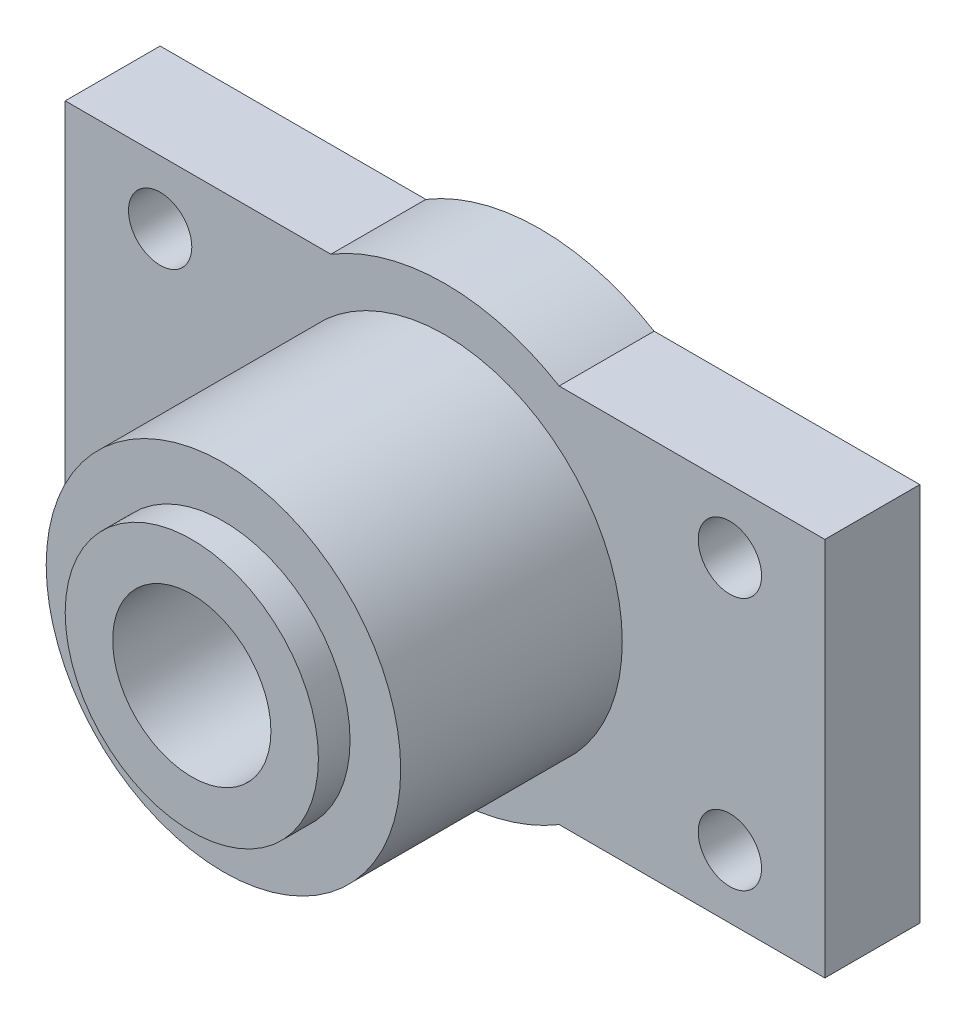
ISO-10303-21;
HEADER;
FILE_DESCRIPTION(('STEP AP214'),'2;1');
FILE_NAME('part.step','',(''),(''),'','','');
FILE_SCHEMA(('AUTOMOTIVE_DESIGN { 1 0 10303 214 1 1 1 1 }'));
ENDSEC;
DATA;
#1=APPLICATION_CONTEXT('core data for automotive mechanical design processes');
#2=APPLICATION_PROTOCOL_DEFINITION('international standard','automotive_design',2000,#1);
#3=PRODUCT_CONTEXT('',#1,'mechanical');
#4=PRODUCT('Part','Part','',(#3));
#5=PRODUCT_RELATED_PRODUCT_CATEGORY('part','',(#4));
#6=PRODUCT_DEFINITION_FORMATION('','',#4);
#7=PRODUCT_DEFINITION_CONTEXT('part definition',#1,'design');
#8=PRODUCT_DEFINITION('design','',#6,#7);
#9=PRODUCT_DEFINITION_SHAPE('','',#8);
#10=(LENGTH_UNIT() NAMED_UNIT(*) SI_UNIT(.MILLI.,.METRE.));
#11=(NAMED_UNIT(*) PLANE_ANGLE_UNIT() SI_UNIT($,.RADIAN.));
#12=(NAMED_UNIT(*) SI_UNIT($,.STERADIAN.) SOLID_ANGLE_UNIT());
#13=UNCERTAINTY_MEASURE_WITH_UNIT(LENGTH_MEASURE(1.E-05),#10,'distance_accuracy_value','');
#14=(GEOMETRIC_REPRESENTATION_CONTEXT(3) GLOBAL_UNCERTAINTY_ASSIGNED_CONTEXT((#13)) GLOBAL_UNIT_ASSIGNED_CONTEXT((#10,
#11,#12)) REPRESENTATION_CONTEXT('',''));
#15=CARTESIAN_POINT('',(0.,0.,0.));
#16=DIRECTION('',(0.,0.,1.));
#17=DIRECTION('',(1.,0.,0.));
#18=AXIS2_PLACEMENT_3D('',#15,#16,#17);
#19=CARTESIAN_POINT('',(0.,0.,15.));
#20=DIRECTION('',(0.,0.,1.));
#21=DIRECTION('',(1.,0.,0.));
#22=AXIS2_PLACEMENT_3D('',#19,#20,#21);
#23=PLANE('',#22);
#24=CARTESIAN_POINT('',(0.,0.,15.));
#25=DIRECTION('',(0.,0.,-1.));
#26=DIRECTION('',(1.,0.,0.));
#27=AXIS2_PLACEMENT_3D('',#24,#25,#26);
#28=CIRCLE('',#27,12.5);
#29=CARTESIAN_POINT('',(12.5,0.,15.));
#30=VERTEX_POINT('',#29);
#31=EDGE_CURVE('E24',#30,#30,#28,.T.);
#32=ORIENTED_EDGE('',*,*,#31,.F.);
#33=EDGE_LOOP('',(#32));
#34=FACE_BOUND('',#33,.T.);
#35=ADVANCED_FACE('F16',(#34),#23,.T.);
#36=CARTESIAN_POINT('',(0.,0.,0.));
#37=DIRECTION('',(0.,0.,-1.));
#38=DIRECTION('',(1.,0.,0.));
#39=AXIS2_PLACEMENT_3D('',#36,#37,#38);
#40=CYLINDRICAL_SURFACE('',#39,12.5);
#41=ORIENTED_EDGE('',*,*,#31,.T.);
#42=DIRECTION('',(0.,0.,1.));
#43=VECTOR('',#42,1.);
#44=CARTESIAN_POINT('',(12.5,0.,0.));
#45=LINE('',#44,#43);
#46=CARTESIAN_POINT('',(12.5,0.,55.));
#47=VERTEX_POINT('',#46);
#48=EDGE_CURVE('E10',#30,#47,#45,.T.);
#49=ORIENTED_EDGE('',*,*,#48,.T.);
#50=CARTESIAN_POINT('',(0.,0.,55.));
#51=DIRECTION('',(0.,0.,-1.));
#52=DIRECTION('',(1.,0.,0.));
#53=AXIS2_PLACEMENT_3D('',#50,#51,#52);
#54=CIRCLE('',#53,12.5);
#55=EDGE_CURVE('E294',#47,#47,#54,.T.);
#56=ORIENTED_EDGE('',*,*,#55,.F.);
#57=ORIENTED_EDGE('',*,*,#48,.F.);
#58=EDGE_LOOP('',(#41,#49,#56,#57));
#59=FACE_BOUND('',#58,.T.);
#60=ADVANCED_FACE('F317',(#59),#40,.F.);
#61=CARTESIAN_POINT('',(0.,0.,55.));
#62=DIRECTION('',(0.,0.,1.));
#63=DIRECTION('',(1.,0.,0.));
#64=AXIS2_PLACEMENT_3D('',#61,#62,#63);
#65=PLANE('',#64);
#66=ORIENTED_EDGE('',*,*,#55,.T.);
#67=EDGE_LOOP('',(#66));
#68=FACE_BOUND('',#67,.T.);
#69=CARTESIAN_POINT('',(0.,0.,55.));
#70=DIRECTION('',(0.,0.,1.));
#71=DIRECTION('',(1.,0.,0.));
#72=AXIS2_PLACEMENT_3D('',#69,#70,#71);
#73=CIRCLE('',#72,20.);
#74=CARTESIAN_POINT('',(20.,0.,55.));
#75=VERTEX_POINT('',#74);
#76=EDGE_CURVE('E291',#75,#75,#73,.T.);
#77=ORIENTED_EDGE('',*,*,#76,.T.);
#78=EDGE_LOOP('',(#77));
#79=FACE_BOUND('',#78,.T.);
#80=ADVANCED_FACE('F324',(#68,#79),#65,.T.);
#81=CARTESIAN_POINT('',(0.,0.,50.));
#82=DIRECTION('',(0.,0.,1.));
#83=DIRECTION('',(1.,0.,0.));
#84=AXIS2_PLACEMENT_3D('',#81,#82,#83);
#85=CYLINDRICAL_SURFACE('',#84,20.);
#86=CARTESIAN_POINT('',(0.,0.,50.));
#87=DIRECTION('',(0.,0.,1.));
#88=DIRECTION('',(1.,0.,0.));
#89=AXIS2_PLACEMENT_3D('',#86,#87,#88);
#90=CIRCLE('',#89,20.);
#91=CARTESIAN_POINT('',(20.,0.,50.));
#92=VERTEX_POINT('',#91);
#93=EDGE_CURVE('E306',#92,#92,#90,.T.);
#94=ORIENTED_EDGE('',*,*,#93,.T.);
#95=DIRECTION('',(0.,0.,1.));
#96=VECTOR('',#95,1.);
#97=CARTESIAN_POINT('',(20.,0.,50.));
#98=LINE('',#97,#96);
#99=EDGE_CURVE('E295',#92,#75,#98,.T.);
#100=ORIENTED_EDGE('',*,*,#99,.T.);
#101=ORIENTED_EDGE('',*,*,#76,.F.);
#102=ORIENTED_EDGE('',*,*,#99,.F.);
#103=EDGE_LOOP('',(#94,#100,#101,#102));
#104=FACE_BOUND('',#103,.T.);
#105=ADVANCED_FACE('F329',(#104),#85,.T.);
#106=CARTESIAN_POINT('',(0.,0.,50.));
#107=DIRECTION('',(0.,0.,1.));
#108=DIRECTION('',(1.,0.,0.));
#109=AXIS2_PLACEMENT_3D('',#106,#107,#108);
#110=PLANE('',#109);
#111=ORIENTED_EDGE('',*,*,#93,.F.);
#112=EDGE_LOOP('',(#111));
#113=FACE_BOUND('',#112,.T.);
#114=CARTESIAN_POINT('',(0.,0.,50.));
#115=DIRECTION('',(0.,0.,1.));
#116=DIRECTION('',(1.,0.,0.));
#117=AXIS2_PLACEMENT_3D('',#114,#115,#116);
#118=CIRCLE('',#117,28.);
#119=CARTESIAN_POINT('',(28.,0.,50.));
#120=VERTEX_POINT('',#119);
#121=EDGE_CURVE('E303',#120,#120,#118,.T.);
#122=ORIENTED_EDGE('',*,*,#121,.T.);
#123=EDGE_LOOP('',(#122));
#124=FACE_BOUND('',#123,.T.);
#125=ADVANCED_FACE('F334',(#113,#124),#110,.T.);
#126=CARTESIAN_POINT('',(0.,0.,15.));
#127=DIRECTION('',(0.,0.,1.));
#128=DIRECTION('',(1.,0.,0.));
#129=AXIS2_PLACEMENT_3D('',#126,#127,#128);
#130=CYLINDRICAL_SURFACE('',#129,28.);
#131=CARTESIAN_POINT('',(0.,0.,15.));
#132=DIRECTION('',(0.,0.,1.));
#133=DIRECTION('',(1.,0.,0.));
#134=AXIS2_PLACEMENT_3D('',#131,#132,#133);
#135=CIRCLE('',#134,28.);
#136=CARTESIAN_POINT('',(28.,0.,15.));
#137=VERTEX_POINT('',#136);
#138=EDGE_CURVE('E290',#137,#137,#135,.T.);
#139=ORIENTED_EDGE('',*,*,#138,.T.);
#140=DIRECTION('',(0.,0.,1.));
#141=VECTOR('',#140,1.);
#142=CARTESIAN_POINT('',(28.,0.,15.));
#143=LINE('',#142,#141);
#144=EDGE_CURVE('E299',#137,#120,#143,.T.);
#145=ORIENTED_EDGE('',*,*,#144,.T.);
#146=ORIENTED_EDGE('',*,*,#121,.F.);
#147=ORIENTED_EDGE('',*,*,#144,.F.);
#148=EDGE_LOOP('',(#139,#145,#146,#147));
#149=FACE_BOUND('',#148,.T.);
#150=ADVANCED_FACE('F336',(#149),#130,.T.);
#151=CARTESIAN_POINT('',(0.,0.,15.));
#152=DIRECTION('',(0.,0.,1.));
#153=DIRECTION('',(1.,0.,0.));
#154=AXIS2_PLACEMENT_3D('',#151,#152,#153);
#155=PLANE('',#154);
#156=CARTESIAN_POINT('',(-45.,-20.,15.));
#157=DIRECTION('',(0.,0.,-1.));
#158=DIRECTION('',(1.,0.,0.));
#159=AXIS2_PLACEMENT_3D('',#156,#157,#158);
#160=CIRCLE('',#159,5.);
#161=CARTESIAN_POINT('',(-40.,-20.,15.));
#162=VERTEX_POINT('',#161);
#163=EDGE_CURVE('E282',#162,#162,#160,.T.);
#164=ORIENTED_EDGE('',*,*,#163,.T.);
#165=EDGE_LOOP('',(#164));
#166=FACE_BOUND('',#165,.T.);
#167=CARTESIAN_POINT('',(-45.,20.,15.));
#168=DIRECTION('',(0.,0.,-1.));
#169=DIRECTION('',(1.,0.,0.));
#170=AXIS2_PLACEMENT_3D('',#167,#168,#169);
#171=CIRCLE('',#170,5.);
#172=CARTESIAN_POINT('',(-40.,20.,15.));
#173=VERTEX_POINT('',#172);
#174=EDGE_CURVE('E195',#173,#173,#171,.T.);
#175=ORIENTED_EDGE('',*,*,#174,.T.);
#176=EDGE_LOOP('',(#175));
#177=FACE_BOUND('',#176,.T.);
#178=ORIENTED_EDGE('',*,*,#138,.F.);
#179=EDGE_LOOP('',(#178));
#180=FACE_BOUND('',#179,.T.);
#181=CARTESIAN_POINT('',(45.,20.,15.));
#182=DIRECTION('',(0.,0.,-1.));
#183=DIRECTION('',(1.,0.,0.));
#184=AXIS2_PLACEMENT_3D('',#181,#182,#183);
#185=CIRCLE('',#184,5.);
#186=CARTESIAN_POINT('',(50.,20.,15.));
#187=VERTEX_POINT('',#186);
#188=EDGE_CURVE('E244',#187,#187,#185,.T.);
#189=ORIENTED_EDGE('',*,*,#188,.T.);
#190=EDGE_LOOP('',(#189));
#191=FACE_BOUND('',#190,.T.);
#192=CARTESIAN_POINT('',(45.,-20.,15.));
#193=DIRECTION('',(0.,0.,-1.));
#194=DIRECTION('',(1.,0.,0.));
#195=AXIS2_PLACEMENT_3D('',#192,#193,#194);
#196=CIRCLE('',#195,5.);
#197=CARTESIAN_POINT('',(50.,-20.,15.));
#198=VERTEX_POINT('',#197);
#199=EDGE_CURVE('E159',#198,#198,#196,.T.);
#200=ORIENTED_EDGE('',*,*,#199,.T.);
#201=EDGE_LOOP('',(#200));
#202=FACE_BOUND('',#201,.T.);
#203=DIRECTION('',(-1.,0.,0.));
#204=VECTOR('',#203,1.);
#205=CARTESIAN_POINT('',(60.,30.,15.));
#206=LINE('',#205,#204);
#207=CARTESIAN_POINT('',(60.,30.,15.));
#208=VERTEX_POINT('',#207);
#209=CARTESIAN_POINT('',(18.027756377319,30.,15.));
#210=VERTEX_POINT('',#209);
#211=EDGE_CURVE('E223',#208,#210,#206,.T.);
#212=ORIENTED_EDGE('',*,*,#211,.T.);
#213=CARTESIAN_POINT('',(0.,0.,15.));
#214=DIRECTION('',(0.,0.,1.));
#215=DIRECTION('',(1.,0.,0.));
#216=AXIS2_PLACEMENT_3D('',#213,#214,#215);
#217=CIRCLE('',#216,35.);
#218=CARTESIAN_POINT('',(-18.02775637732,30.,15.));
#219=VERTEX_POINT('',#218);
#220=EDGE_CURVE('E260',#210,#219,#217,.T.);
#221=ORIENTED_EDGE('',*,*,#220,.T.);
#222=DIRECTION('',(-1.,0.,0.));
#223=VECTOR('',#222,1.);
#224=CARTESIAN_POINT('',(60.,30.,15.));
#225=LINE('',#224,#223);
#226=CARTESIAN_POINT('',(-60.,30.,15.));
#227=VERTEX_POINT('',#226);
#228=EDGE_CURVE('E214',#219,#227,#225,.T.);
#229=ORIENTED_EDGE('',*,*,#228,.T.);
#230=DIRECTION('',(0.,-1.,0.));
#231=VECTOR('',#230,1.);
#232=CARTESIAN_POINT('',(-60.,30.,15.));
#233=LINE('',#232,#231);
#234=CARTESIAN_POINT('',(-60.,-30.,15.));
#235=VERTEX_POINT('',#234);
#236=EDGE_CURVE('E265',#227,#235,#233,.T.);
#237=ORIENTED_EDGE('',*,*,#236,.T.);
#238=DIRECTION('',(1.,0.,0.));
#239=VECTOR('',#238,1.);
#240=CARTESIAN_POINT('',(-60.,-30.,15.));
#241=LINE('',#240,#239);
#242=CARTESIAN_POINT('',(-18.02775637732,-30.,15.));
#243=VERTEX_POINT('',#242);
#244=EDGE_CURVE('E213',#235,#243,#241,.T.);
#245=ORIENTED_EDGE('',*,*,#244,.T.);
#246=CARTESIAN_POINT('',(0.,0.,15.));
#247=DIRECTION('',(0.,0.,1.));
#248=DIRECTION('',(1.,0.,0.));
#249=AXIS2_PLACEMENT_3D('',#246,#247,#248);
#250=CIRCLE('',#249,35.);
#251=CARTESIAN_POINT('',(18.027756377319,-30.,15.));
#252=VERTEX_POINT('',#251);
#253=EDGE_CURVE('E198',#243,#252,#250,.T.);
#254=ORIENTED_EDGE('',*,*,#253,.T.);
#255=DIRECTION('',(1.,0.,0.));
#256=VECTOR('',#255,1.);
#257=CARTESIAN_POINT('',(-60.,-30.,15.));
#258=LINE('',#257,#256);
#259=CARTESIAN_POINT('',(60.,-30.,15.));
#260=VERTEX_POINT('',#259);
#261=EDGE_CURVE('E241',#252,#260,#258,.T.);
#262=ORIENTED_EDGE('',*,*,#261,.T.);
#263=DIRECTION('',(0.,1.,0.));
#264=VECTOR('',#263,1.);
#265=CARTESIAN_POINT('',(60.,-30.,15.));
#266=LINE('',#265,#264);
#267=EDGE_CURVE('E234',#260,#208,#266,.T.);
#268=ORIENTED_EDGE('',*,*,#267,.T.);
#269=EDGE_LOOP('',(#212,#221,#229,#237,#245,#254,#262,#268));
#270=FACE_BOUND('',#269,.T.);
#271=ADVANCED_FACE('F339',(#166,#177,#180,#191,#202,#270),#155,.T.);
#272=CARTESIAN_POINT('',(0.,0.,0.));
#273=DIRECTION('',(0.,0.,1.));
#274=DIRECTION('',(1.,0.,0.));
#275=AXIS2_PLACEMENT_3D('',#272,#273,#274);
#276=CYLINDRICAL_SURFACE('',#275,35.);
#277=CARTESIAN_POINT('',(0.,0.,0.));
#278=DIRECTION('',(0.,0.,1.));
#279=DIRECTION('',(1.,0.,0.));
#280=AXIS2_PLACEMENT_3D('',#277,#278,#279);
#281=CIRCLE('',#280,35.);
#282=CARTESIAN_POINT('',(-18.02775637732,-30.,0.));
#283=VERTEX_POINT('',#282);
#284=CARTESIAN_POINT('',(18.027756377319,-30.,0.));
#285=VERTEX_POINT('',#284);
#286=EDGE_CURVE('E179',#283,#285,#281,.T.);
#287=ORIENTED_EDGE('',*,*,#286,.T.);
#288=DIRECTION('',(0.,0.,1.));
#289=VECTOR('',#288,1.);
#290=CARTESIAN_POINT('',(18.02775637732,-30.,0.));
#291=LINE('',#290,#289);
#292=EDGE_CURVE('E161',#285,#252,#291,.T.);
#293=ORIENTED_EDGE('',*,*,#292,.T.);
#294=ORIENTED_EDGE('',*,*,#253,.F.);
#295=DIRECTION('',(0.,0.,1.));
#296=VECTOR('',#295,1.);
#297=CARTESIAN_POINT('',(-18.02775637732,-30.,0.));
#298=LINE('',#297,#296);
#299=EDGE_CURVE('E209',#283,#243,#298,.T.);
#300=ORIENTED_EDGE('',*,*,#299,.F.);
#301=EDGE_LOOP('',(#287,#293,#294,#300));
#302=FACE_BOUND('',#301,.T.);
#303=ADVANCED_FACE('F343',(#302),#276,.T.);
#304=CARTESIAN_POINT('',(-45.,20.,0.));
#305=DIRECTION('',(0.,0.,-1.));
#306=DIRECTION('',(1.,0.,0.));
#307=AXIS2_PLACEMENT_3D('',#304,#305,#306);
#308=CYLINDRICAL_SURFACE('',#307,5.);
#309=CARTESIAN_POINT('',(-45.,20.,0.));
#310=DIRECTION('',(0.,0.,1.));
#311=DIRECTION('',(1.,0.,0.));
#312=AXIS2_PLACEMENT_3D('',#309,#310,#311);
#313=CIRCLE('',#312,5.);
#314=CARTESIAN_POINT('',(-40.,20.,0.));
#315=VERTEX_POINT('',#314);
#316=EDGE_CURVE('E208',#315,#315,#313,.T.);
#317=ORIENTED_EDGE('',*,*,#316,.F.);
#318=DIRECTION('',(0.,0.,1.));
#319=VECTOR('',#318,1.);
#320=CARTESIAN_POINT('',(-40.,20.,0.));
#321=LINE('',#320,#319);
#322=EDGE_CURVE('E199',#315,#173,#321,.T.);
#323=ORIENTED_EDGE('',*,*,#322,.T.);
#324=ORIENTED_EDGE('',*,*,#174,.F.);
#325=ORIENTED_EDGE('',*,*,#322,.F.);
#326=EDGE_LOOP('',(#317,#323,#324,#325));
#327=FACE_BOUND('',#326,.T.);
#328=ADVANCED_FACE('F347',(#327),#308,.F.);
#329=CARTESIAN_POINT('',(-45.,-20.,0.));
#330=DIRECTION('',(0.,0.,-1.));
#331=DIRECTION('',(1.,0.,0.));
#332=AXIS2_PLACEMENT_3D('',#329,#330,#331);
#333=CYLINDRICAL_SURFACE('',#332,5.);
#334=CARTESIAN_POINT('',(-45.,-20.,0.));
#335=DIRECTION('',(0.,0.,1.));
#336=DIRECTION('',(1.,0.,0.));
#337=AXIS2_PLACEMENT_3D('',#334,#335,#336);
#338=CIRCLE('',#337,5.);
#339=CARTESIAN_POINT('',(-40.,-20.,0.));
#340=VERTEX_POINT('',#339);
#341=EDGE_CURVE('E218',#340,#340,#338,.T.);
#342=ORIENTED_EDGE('',*,*,#341,.F.);
#343=DIRECTION('',(0.,0.,1.));
#344=VECTOR('',#343,1.);
#345=CARTESIAN_POINT('',(-40.,-20.,0.));
#346=LINE('',#345,#344);
#347=EDGE_CURVE('E278',#340,#162,#346,.T.);
#348=ORIENTED_EDGE('',*,*,#347,.T.);
#349=ORIENTED_EDGE('',*,*,#163,.F.);
#350=ORIENTED_EDGE('',*,*,#347,.F.);
#351=EDGE_LOOP('',(#342,#348,#349,#350));
#352=FACE_BOUND('',#351,.T.);
#353=ADVANCED_FACE('F349',(#352),#333,.F.);
#354=CARTESIAN_POINT('',(-60.,-30.,0.));
#355=DIRECTION('',(0.,1.,0.));
#356=DIRECTION('',(1.,0.,0.));
#357=AXIS2_PLACEMENT_3D('',#354,#355,#356);
#358=PLANE('',#357);
#359=ORIENTED_EDGE('',*,*,#299,.T.);
#360=ORIENTED_EDGE('',*,*,#244,.F.);
#361=DIRECTION('',(0.,0.,1.));
#362=VECTOR('',#361,1.);
#363=CARTESIAN_POINT('',(-60.,-30.,0.));
#364=LINE('',#363,#362);
#365=CARTESIAN_POINT('',(-60.,-30.,0.));
#366=VERTEX_POINT('',#365);
#367=EDGE_CURVE('E261',#366,#235,#364,.T.);
#368=ORIENTED_EDGE('',*,*,#367,.F.);
#369=DIRECTION('',(1.,0.,0.));
#370=VECTOR('',#369,1.);
#371=CARTESIAN_POINT('',(-60.,-30.,0.));
#372=LINE('',#371,#370);
#373=EDGE_CURVE('E183',#366,#283,#372,.T.);
#374=ORIENTED_EDGE('',*,*,#373,.T.);
#375=EDGE_LOOP('',(#359,#360,#368,#374));
#376=FACE_BOUND('',#375,.T.);
#377=ADVANCED_FACE('F352',(#376),#358,.F.);
#378=CARTESIAN_POINT('',(60.,30.,0.));
#379=DIRECTION('',(0.,-1.,0.));
#380=DIRECTION('',(0.,0.,-1.));
#381=AXIS2_PLACEMENT_3D('',#378,#379,#380);
#382=PLANE('',#381);
#383=DIRECTION('',(0.,0.,1.));
#384=VECTOR('',#383,1.);
#385=CARTESIAN_POINT('',(-60.,30.,0.));
#386=LINE('',#385,#384);
#387=CARTESIAN_POINT('',(-60.,30.,0.));
#388=VERTEX_POINT('',#387);
#389=EDGE_CURVE('E269',#388,#227,#386,.T.);
#390=ORIENTED_EDGE('',*,*,#389,.T.);
#391=ORIENTED_EDGE('',*,*,#228,.F.);
#392=DIRECTION('',(0.,0.,1.));
#393=VECTOR('',#392,1.);
#394=CARTESIAN_POINT('',(-18.02775637732,30.,0.));
#395=LINE('',#394,#393);
#396=CARTESIAN_POINT('',(-18.02775637732,30.,0.));
#397=VERTEX_POINT('',#396);
#398=EDGE_CURVE('E247',#397,#219,#395,.T.);
#399=ORIENTED_EDGE('',*,*,#398,.F.);
#400=DIRECTION('',(-1.,0.,0.));
#401=VECTOR('',#400,1.);
#402=CARTESIAN_POINT('',(60.,30.,0.));
#403=LINE('',#402,#401);
#404=EDGE_CURVE('E200',#397,#388,#403,.T.);
#405=ORIENTED_EDGE('',*,*,#404,.T.);
#406=EDGE_LOOP('',(#390,#391,#399,#405));
#407=FACE_BOUND('',#406,.T.);
#408=ADVANCED_FACE('F356',(#407),#382,.F.);
#409=CARTESIAN_POINT('',(-60.,30.,0.));
#410=DIRECTION('',(1.,0.,0.));
#411=DIRECTION('',(0.,1.,0.));
#412=AXIS2_PLACEMENT_3D('',#409,#410,#411);
#413=PLANE('',#412);
#414=DIRECTION('',(0.,-1.,0.));
#415=VECTOR('',#414,1.);
#416=CARTESIAN_POINT('',(-60.,30.,0.));
#417=LINE('',#416,#415);
#418=EDGE_CURVE('E188',#388,#366,#417,.T.);
#419=ORIENTED_EDGE('',*,*,#418,.T.);
#420=ORIENTED_EDGE('',*,*,#367,.T.);
#421=ORIENTED_EDGE('',*,*,#236,.F.);
#422=ORIENTED_EDGE('',*,*,#389,.F.);
#423=EDGE_LOOP('',(#419,#420,#421,#422));
#424=FACE_BOUND('',#423,.T.);
#425=ADVANCED_FACE('F363',(#424),#413,.F.);
#426=CARTESIAN_POINT('',(0.,0.,0.));
#427=DIRECTION('',(0.,0.,1.));
#428=DIRECTION('',(1.,0.,0.));
#429=AXIS2_PLACEMENT_3D('',#426,#427,#428);
#430=CYLINDRICAL_SURFACE('',#429,35.);
#431=DIRECTION('',(0.,0.,1.));
#432=VECTOR('',#431,1.);
#433=CARTESIAN_POINT('',(18.02775637732,30.,0.));
#434=LINE('',#433,#432);
#435=CARTESIAN_POINT('',(18.027756377319,30.,0.));
#436=VERTEX_POINT('',#435);
#437=EDGE_CURVE('E222',#436,#210,#434,.T.);
#438=ORIENTED_EDGE('',*,*,#437,.F.);
#439=CARTESIAN_POINT('',(0.,0.,0.));
#440=DIRECTION('',(0.,0.,1.));
#441=DIRECTION('',(1.,0.,0.));
#442=AXIS2_PLACEMENT_3D('',#439,#440,#441);
#443=CIRCLE('',#442,35.);
#444=EDGE_CURVE('E204',#436,#397,#443,.T.);
#445=ORIENTED_EDGE('',*,*,#444,.T.);
#446=ORIENTED_EDGE('',*,*,#398,.T.);
#447=ORIENTED_EDGE('',*,*,#220,.F.);
#448=EDGE_LOOP('',(#438,#445,#446,#447));
#449=FACE_BOUND('',#448,.T.);
#450=ADVANCED_FACE('F367',(#449),#430,.T.);
#451=CARTESIAN_POINT('',(45.,20.,0.));
#452=DIRECTION('',(0.,0.,-1.));
#453=DIRECTION('',(1.,0.,0.));
#454=AXIS2_PLACEMENT_3D('',#451,#452,#453);
#455=CYLINDRICAL_SURFACE('',#454,5.);
#456=CARTESIAN_POINT('',(45.,20.,0.));
#457=DIRECTION('',(0.,0.,1.));
#458=DIRECTION('',(1.,0.,0.));
#459=AXIS2_PLACEMENT_3D('',#456,#457,#458);
#460=CIRCLE('',#459,5.);
#461=CARTESIAN_POINT('',(50.,20.,0.));
#462=VERTEX_POINT('',#461);
#463=EDGE_CURVE('E166',#462,#462,#460,.T.);
#464=ORIENTED_EDGE('',*,*,#463,.F.);
#465=DIRECTION('',(0.,0.,1.));
#466=VECTOR('',#465,1.);
#467=CARTESIAN_POINT('',(50.,20.,0.));
#468=LINE('',#467,#466);
#469=EDGE_CURVE('E248',#462,#187,#468,.T.);
#470=ORIENTED_EDGE('',*,*,#469,.T.);
#471=ORIENTED_EDGE('',*,*,#188,.F.);
#472=ORIENTED_EDGE('',*,*,#469,.F.);
#473=EDGE_LOOP('',(#464,#470,#471,#472));
#474=FACE_BOUND('',#473,.T.);
#475=ADVANCED_FACE('F369',(#474),#455,.F.);
#476=CARTESIAN_POINT('',(45.,-20.,0.));
#477=DIRECTION('',(0.,0.,-1.));
#478=DIRECTION('',(1.,0.,0.));
#479=AXIS2_PLACEMENT_3D('',#476,#477,#478);
#480=CYLINDRICAL_SURFACE('',#479,5.);
#481=CARTESIAN_POINT('',(45.,-20.,0.));
#482=DIRECTION('',(0.,0.,1.));
#483=DIRECTION('',(1.,0.,0.));
#484=AXIS2_PLACEMENT_3D('',#481,#482,#483);
#485=CIRCLE('',#484,5.);
#486=CARTESIAN_POINT('',(50.,-20.,0.));
#487=VERTEX_POINT('',#486);
#488=EDGE_CURVE('E158',#487,#487,#485,.T.);
#489=ORIENTED_EDGE('',*,*,#488,.F.);
#490=DIRECTION('',(0.,0.,1.));
#491=VECTOR('',#490,1.);
#492=CARTESIAN_POINT('',(50.,-20.,0.));
#493=LINE('',#492,#491);
#494=EDGE_CURVE('E155',#487,#198,#493,.T.);
#495=ORIENTED_EDGE('',*,*,#494,.T.);
#496=ORIENTED_EDGE('',*,*,#199,.F.);
#497=ORIENTED_EDGE('',*,*,#494,.F.);
#498=EDGE_LOOP('',(#489,#495,#496,#497));
#499=FACE_BOUND('',#498,.T.);
#500=ADVANCED_FACE('F157',(#499),#480,.F.);
#501=CARTESIAN_POINT('',(-60.,-30.,0.));
#502=DIRECTION('',(0.,1.,0.));
#503=DIRECTION('',(1.,0.,0.));
#504=AXIS2_PLACEMENT_3D('',#501,#502,#503);
#505=PLANE('',#504);
#506=DIRECTION('',(0.,0.,1.));
#507=VECTOR('',#506,1.);
#508=CARTESIAN_POINT('',(60.,-30.,0.));
#509=LINE('',#508,#507);
#510=CARTESIAN_POINT('',(60.,-30.,0.));
#511=VERTEX_POINT('',#510);
#512=EDGE_CURVE('E237',#511,#260,#509,.T.);
#513=ORIENTED_EDGE('',*,*,#512,.T.);
#514=ORIENTED_EDGE('',*,*,#261,.F.);
#515=ORIENTED_EDGE('',*,*,#292,.F.);
#516=DIRECTION('',(1.,0.,0.));
#517=VECTOR('',#516,1.);
#518=CARTESIAN_POINT('',(-60.,-30.,0.));
#519=LINE('',#518,#517);
#520=EDGE_CURVE('E184',#285,#511,#519,.T.);
#521=ORIENTED_EDGE('',*,*,#520,.T.);
#522=EDGE_LOOP('',(#513,#514,#515,#521));
#523=FACE_BOUND('',#522,.T.);
#524=ADVANCED_FACE('F375',(#523),#505,.F.);
#525=CARTESIAN_POINT('',(60.,-30.,0.));
#526=DIRECTION('',(-1.,0.,0.));
#527=DIRECTION('',(0.,0.,1.));
#528=AXIS2_PLACEMENT_3D('',#525,#526,#527);
#529=PLANE('',#528);
#530=DIRECTION('',(0.,1.,0.));
#531=VECTOR('',#530,1.);
#532=CARTESIAN_POINT('',(60.,-30.,0.));
#533=LINE('',#532,#531);
#534=CARTESIAN_POINT('',(60.,30.,0.));
#535=VERTEX_POINT('',#534);
#536=EDGE_CURVE('E178',#511,#535,#533,.T.);
#537=ORIENTED_EDGE('',*,*,#536,.T.);
#538=DIRECTION('',(0.,0.,1.));
#539=VECTOR('',#538,1.);
#540=CARTESIAN_POINT('',(60.,30.,0.));
#541=LINE('',#540,#539);
#542=EDGE_CURVE('E227',#535,#208,#541,.T.);
#543=ORIENTED_EDGE('',*,*,#542,.T.);
#544=ORIENTED_EDGE('',*,*,#267,.F.);
#545=ORIENTED_EDGE('',*,*,#512,.F.);
#546=EDGE_LOOP('',(#537,#543,#544,#545));
#547=FACE_BOUND('',#546,.T.);
#548=ADVANCED_FACE('F376',(#547),#529,.F.);
#549=CARTESIAN_POINT('',(60.,30.,0.));
#550=DIRECTION('',(0.,-1.,0.));
#551=DIRECTION('',(0.,0.,-1.));
#552=AXIS2_PLACEMENT_3D('',#549,#550,#551);
#553=PLANE('',#552);
#554=ORIENTED_EDGE('',*,*,#437,.T.);
#555=ORIENTED_EDGE('',*,*,#211,.F.);
#556=ORIENTED_EDGE('',*,*,#542,.F.);
#557=DIRECTION('',(-1.,0.,0.));
#558=VECTOR('',#557,1.);
#559=CARTESIAN_POINT('',(60.,30.,0.));
#560=LINE('',#559,#558);
#561=EDGE_CURVE('E172',#535,#436,#560,.T.);
#562=ORIENTED_EDGE('',*,*,#561,.T.);
#563=EDGE_LOOP('',(#554,#555,#556,#562));
#564=FACE_BOUND('',#563,.T.);
#565=ADVANCED_FACE('F379',(#564),#553,.F.);
#566=CARTESIAN_POINT('',(0.,0.,0.));
#567=DIRECTION('',(0.,0.,1.));
#568=DIRECTION('',(1.,0.,0.));
#569=AXIS2_PLACEMENT_3D('',#566,#567,#568);
#570=PLANE('',#569);
#571=ORIENTED_EDGE('',*,*,#341,.T.);
#572=EDGE_LOOP('',(#571));
#573=FACE_BOUND('',#572,.T.);
#574=ORIENTED_EDGE('',*,*,#316,.T.);
#575=EDGE_LOOP('',(#574));
#576=FACE_BOUND('',#575,.T.);
#577=ORIENTED_EDGE('',*,*,#561,.F.);
#578=ORIENTED_EDGE('',*,*,#536,.F.);
#579=ORIENTED_EDGE('',*,*,#520,.F.);
#580=ORIENTED_EDGE('',*,*,#286,.F.);
#581=ORIENTED_EDGE('',*,*,#373,.F.);
#582=ORIENTED_EDGE('',*,*,#418,.F.);
#583=ORIENTED_EDGE('',*,*,#404,.F.);
#584=ORIENTED_EDGE('',*,*,#444,.F.);
#585=EDGE_LOOP('',(#577,#578,#579,#580,#581,#582,#583,#584));
#586=FACE_BOUND('',#585,.T.);
#587=ORIENTED_EDGE('',*,*,#463,.T.);
#588=EDGE_LOOP('',(#587));
#589=FACE_BOUND('',#588,.T.);
#590=ORIENTED_EDGE('',*,*,#488,.T.);
#591=EDGE_LOOP('',(#590));
#592=FACE_BOUND('',#591,.T.);
#593=ADVANCED_FACE('F164',(#573,#576,#586,#589,#592),#570,.F.);
#594=CLOSED_SHELL('',(#35,#60,#80,#105,#125,#150,#271,#303,#328,#353,#377,#408,#425,#450,#475,
#500,#524,#548,#565,#593));
#595=MANIFOLD_SOLID_BREP('B1',#594);
#596=ADVANCED_BREP_SHAPE_REPRESENTATION('',(#18,#595),#14);
#597=SHAPE_DEFINITION_REPRESENTATION(#9,#596);
ENDSEC;
END-ISO-10303-21;
